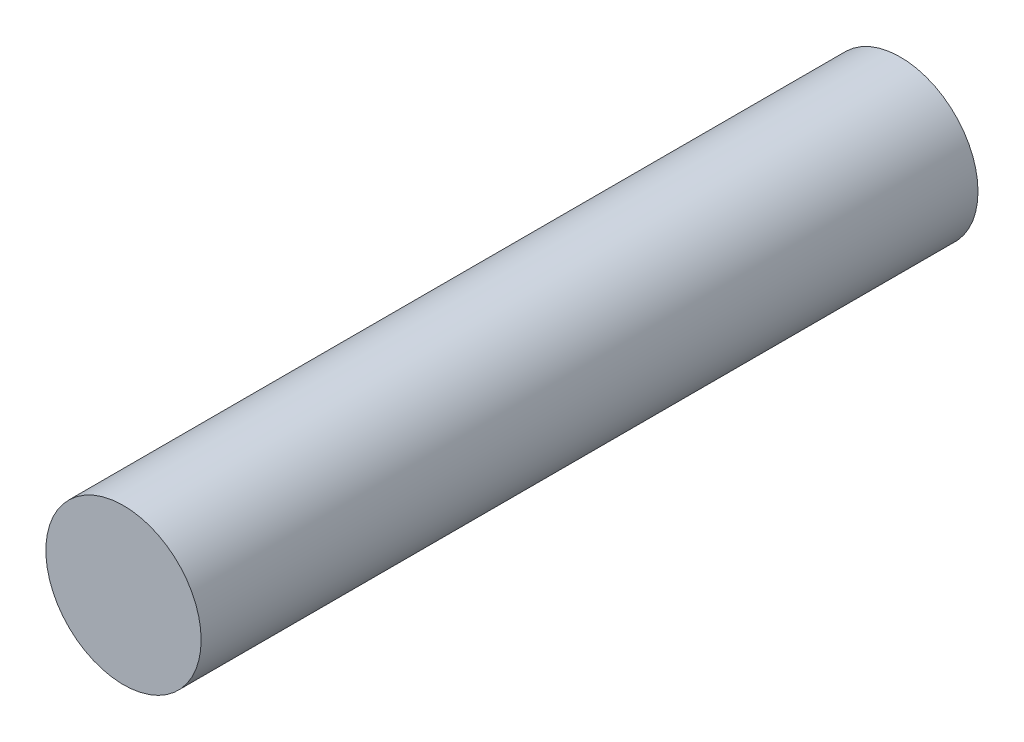
ISO-10303-21;
HEADER;
FILE_DESCRIPTION(('STEP AP214'),'2;1');
FILE_NAME('part.step','',(''),(''),'','','');
FILE_SCHEMA(('AUTOMOTIVE_DESIGN { 1 0 10303 214 1 1 1 1 }'));
ENDSEC;
DATA;
#1=APPLICATION_CONTEXT('core data for automotive mechanical design processes');
#2=APPLICATION_PROTOCOL_DEFINITION('international standard','automotive_design',2000,#1);
#3=PRODUCT_CONTEXT('',#1,'mechanical');
#4=PRODUCT('Part','Part','',(#3));
#5=PRODUCT_RELATED_PRODUCT_CATEGORY('part','',(#4));
#6=PRODUCT_DEFINITION_FORMATION('','',#4);
#7=PRODUCT_DEFINITION_CONTEXT('part definition',#1,'design');
#8=PRODUCT_DEFINITION('design','',#6,#7);
#9=PRODUCT_DEFINITION_SHAPE('','',#8);
#10=(LENGTH_UNIT() NAMED_UNIT(*) SI_UNIT(.MILLI.,.METRE.));
#11=(NAMED_UNIT(*) PLANE_ANGLE_UNIT() SI_UNIT($,.RADIAN.));
#12=(NAMED_UNIT(*) SI_UNIT($,.STERADIAN.) SOLID_ANGLE_UNIT());
#13=UNCERTAINTY_MEASURE_WITH_UNIT(LENGTH_MEASURE(1.E-05),#10,'distance_accuracy_value','');
#14=(GEOMETRIC_REPRESENTATION_CONTEXT(3) GLOBAL_UNCERTAINTY_ASSIGNED_CONTEXT((#13)) GLOBAL_UNIT_ASSIGNED_CONTEXT((#10,
#11,#12)) REPRESENTATION_CONTEXT('',''));
#15=CARTESIAN_POINT('',(0.,0.,0.));
#16=DIRECTION('',(0.,0.,1.));
#17=DIRECTION('',(1.,0.,0.));
#18=AXIS2_PLACEMENT_3D('',#15,#16,#17);
#19=CARTESIAN_POINT('',(0.,0.,-44.));
#20=DIRECTION('',(0.,0.,1.));
#21=DIRECTION('',(1.,0.,0.));
#22=AXIS2_PLACEMENT_3D('',#19,#20,#21);
#23=CYLINDRICAL_SURFACE('',#22,4.9975);
#24=CARTESIAN_POINT('',(0.,0.,-44.));
#25=DIRECTION('',(0.,0.,1.));
#26=DIRECTION('',(1.,0.,0.));
#27=AXIS2_PLACEMENT_3D('',#24,#25,#26);
#28=CIRCLE('',#27,4.9975);
#29=CARTESIAN_POINT('',(4.9975,0.,-44.));
#30=VERTEX_POINT('',#29);
#31=EDGE_CURVE('E10',#30,#30,#28,.T.);
#32=ORIENTED_EDGE('',*,*,#31,.T.);
#33=EDGE_LOOP('',(#32));
#34=FACE_BOUND('',#33,.T.);
#35=CARTESIAN_POINT('',(0.,0.,6.));
#36=DIRECTION('',(0.,0.,1.));
#37=DIRECTION('',(1.,0.,0.));
#38=AXIS2_PLACEMENT_3D('',#35,#36,#37);
#39=CIRCLE('',#38,4.9975);
#40=CARTESIAN_POINT('',(4.9975,0.,6.));
#41=VERTEX_POINT('',#40);
#42=EDGE_CURVE('E47',#41,#41,#39,.T.);
#43=ORIENTED_EDGE('',*,*,#42,.F.);
#44=EDGE_LOOP('',(#43));
#45=FACE_BOUND('',#44,.T.);
#46=ADVANCED_FACE('F40',(#34,#45),#23,.T.);
#47=CARTESIAN_POINT('',(0.,0.,-44.));
#48=DIRECTION('',(0.,0.,1.));
#49=DIRECTION('',(1.,0.,0.));
#50=AXIS2_PLACEMENT_3D('',#47,#48,#49);
#51=PLANE('',#50);
#52=ORIENTED_EDGE('',*,*,#31,.F.);
#53=EDGE_LOOP('',(#52));
#54=FACE_BOUND('',#53,.T.);
#55=ADVANCED_FACE('F59',(#54),#51,.F.);
#56=CARTESIAN_POINT('',(0.,0.,6.));
#57=DIRECTION('',(0.,0.,1.));
#58=DIRECTION('',(1.,0.,0.));
#59=AXIS2_PLACEMENT_3D('',#56,#57,#58);
#60=PLANE('',#59);
#61=ORIENTED_EDGE('',*,*,#42,.T.);
#62=EDGE_LOOP('',(#61));
#63=FACE_BOUND('',#62,.T.);
#64=ADVANCED_FACE('F56',(#63),#60,.T.);
#65=CLOSED_SHELL('',(#46,#55,#64));
#66=MANIFOLD_SOLID_BREP('B2',#65);
#67=ADVANCED_BREP_SHAPE_REPRESENTATION('',(#18,#66),#14);
#68=SHAPE_DEFINITION_REPRESENTATION(#9,#67);
ENDSEC;
END-ISO-10303-21;
